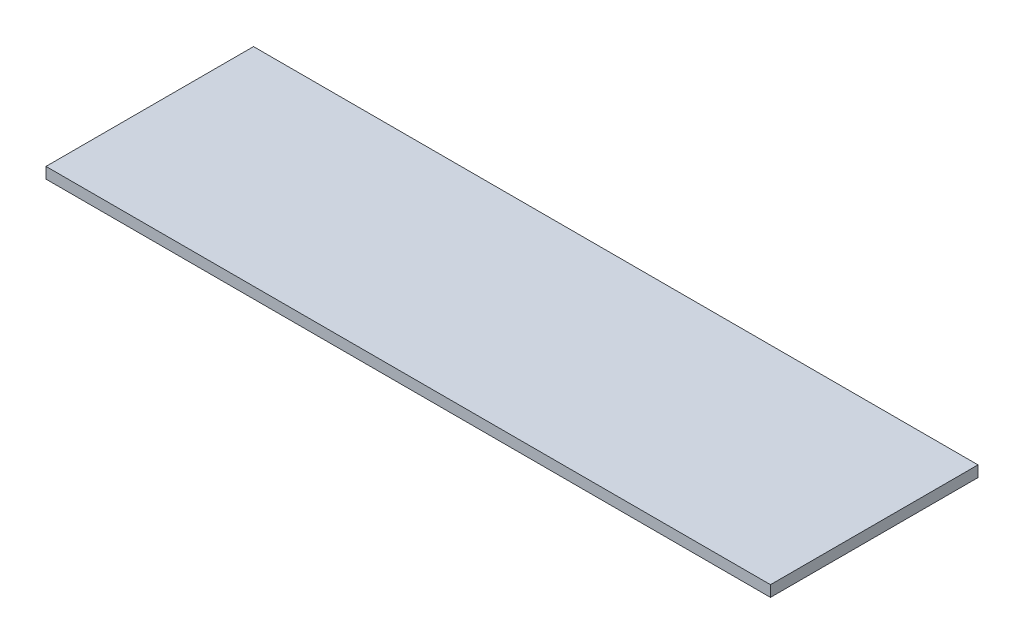
ISO-10303-21;
HEADER;
FILE_DESCRIPTION(('STEP AP214'),'2;1');
FILE_NAME('part.step','',(''),(''),'','','');
FILE_SCHEMA(('AUTOMOTIVE_DESIGN { 1 0 10303 214 1 1 1 1 }'));
ENDSEC;
DATA;
#1=APPLICATION_CONTEXT('core data for automotive mechanical design processes');
#2=APPLICATION_PROTOCOL_DEFINITION('international standard','automotive_design',2000,#1);
#3=PRODUCT_CONTEXT('',#1,'mechanical');
#4=PRODUCT('Part','Part','',(#3));
#5=PRODUCT_RELATED_PRODUCT_CATEGORY('part','',(#4));
#6=PRODUCT_DEFINITION_FORMATION('','',#4);
#7=PRODUCT_DEFINITION_CONTEXT('part definition',#1,'design');
#8=PRODUCT_DEFINITION('design','',#6,#7);
#9=PRODUCT_DEFINITION_SHAPE('','',#8);
#10=(LENGTH_UNIT() NAMED_UNIT(*) SI_UNIT(.MILLI.,.METRE.));
#11=(NAMED_UNIT(*) PLANE_ANGLE_UNIT() SI_UNIT($,.RADIAN.));
#12=(NAMED_UNIT(*) SI_UNIT($,.STERADIAN.) SOLID_ANGLE_UNIT());
#13=UNCERTAINTY_MEASURE_WITH_UNIT(LENGTH_MEASURE(1.E-05),#10,'distance_accuracy_value','');
#14=(GEOMETRIC_REPRESENTATION_CONTEXT(3) GLOBAL_UNCERTAINTY_ASSIGNED_CONTEXT((#13)) GLOBAL_UNIT_ASSIGNED_CONTEXT((#10,
#11,#12)) REPRESENTATION_CONTEXT('',''));
#15=CARTESIAN_POINT('',(0.,0.,0.));
#16=DIRECTION('',(0.,0.,1.));
#17=DIRECTION('',(1.,0.,0.));
#18=AXIS2_PLACEMENT_3D('',#15,#16,#17);
#19=CARTESIAN_POINT('',(-147.5,4.5,42.25));
#20=DIRECTION('',(1.,0.,0.));
#21=DIRECTION('',(0.,0.,-1.));
#22=AXIS2_PLACEMENT_3D('',#19,#20,#21);
#23=PLANE('',#22);
#24=DIRECTION('',(0.,0.,1.));
#25=VECTOR('',#24,1.);
#26=CARTESIAN_POINT('',(-147.5,0.,42.25));
#27=LINE('',#26,#25);
#28=CARTESIAN_POINT('',(-147.5,0.,-42.25));
#29=VERTEX_POINT('',#28);
#30=CARTESIAN_POINT('',(-147.5,0.,42.25));
#31=VERTEX_POINT('',#30);
#32=EDGE_CURVE('E96',#29,#31,#27,.T.);
#33=ORIENTED_EDGE('',*,*,#32,.T.);
#34=DIRECTION('',(0.,-1.,0.));
#35=VECTOR('',#34,1.);
#36=CARTESIAN_POINT('',(-147.5,4.5,42.25));
#37=LINE('',#36,#35);
#38=CARTESIAN_POINT('',(-147.5,4.5,42.25));
#39=VERTEX_POINT('',#38);
#40=EDGE_CURVE('E11',#39,#31,#37,.T.);
#41=ORIENTED_EDGE('',*,*,#40,.F.);
#42=DIRECTION('',(0.,0.,1.));
#43=VECTOR('',#42,1.);
#44=CARTESIAN_POINT('',(-147.5,4.5,42.25));
#45=LINE('',#44,#43);
#46=CARTESIAN_POINT('',(-147.5,4.5,-42.25));
#47=VERTEX_POINT('',#46);
#48=EDGE_CURVE('E84',#47,#39,#45,.T.);
#49=ORIENTED_EDGE('',*,*,#48,.F.);
#50=DIRECTION('',(0.,-1.,0.));
#51=VECTOR('',#50,1.);
#52=CARTESIAN_POINT('',(-147.5,4.5,-42.25));
#53=LINE('',#52,#51);
#54=EDGE_CURVE('E92',#47,#29,#53,.T.);
#55=ORIENTED_EDGE('',*,*,#54,.T.);
#56=EDGE_LOOP('',(#33,#41,#49,#55));
#57=FACE_BOUND('',#56,.T.);
#58=ADVANCED_FACE('F33',(#57),#23,.F.);
#59=CARTESIAN_POINT('',(147.5,4.5,42.25));
#60=DIRECTION('',(0.,0.,-1.));
#61=DIRECTION('',(-1.,0.,0.));
#62=AXIS2_PLACEMENT_3D('',#59,#60,#61);
#63=PLANE('',#62);
#64=DIRECTION('',(1.,0.,0.));
#65=VECTOR('',#64,1.);
#66=CARTESIAN_POINT('',(147.5,0.,42.25));
#67=LINE('',#66,#65);
#68=CARTESIAN_POINT('',(147.5,0.,42.25));
#69=VERTEX_POINT('',#68);
#70=EDGE_CURVE('E88',#31,#69,#67,.T.);
#71=ORIENTED_EDGE('',*,*,#70,.T.);
#72=DIRECTION('',(0.,-1.,0.));
#73=VECTOR('',#72,1.);
#74=CARTESIAN_POINT('',(147.5,4.5,42.25));
#75=LINE('',#74,#73);
#76=CARTESIAN_POINT('',(147.5,4.5,42.25));
#77=VERTEX_POINT('',#76);
#78=EDGE_CURVE('E41',#77,#69,#75,.T.);
#79=ORIENTED_EDGE('',*,*,#78,.F.);
#80=DIRECTION('',(1.,0.,0.));
#81=VECTOR('',#80,1.);
#82=CARTESIAN_POINT('',(147.5,4.5,42.25));
#83=LINE('',#82,#81);
#84=EDGE_CURVE('E79',#39,#77,#83,.T.);
#85=ORIENTED_EDGE('',*,*,#84,.F.);
#86=ORIENTED_EDGE('',*,*,#40,.T.);
#87=EDGE_LOOP('',(#71,#79,#85,#86));
#88=FACE_BOUND('',#87,.T.);
#89=ADVANCED_FACE('F87',(#88),#63,.F.);
#90=CARTESIAN_POINT('',(147.5,4.5,42.25));
#91=DIRECTION('',(-1.,0.,0.));
#92=DIRECTION('',(0.,0.,1.));
#93=AXIS2_PLACEMENT_3D('',#90,#91,#92);
#94=PLANE('',#93);
#95=DIRECTION('',(0.,0.,-1.));
#96=VECTOR('',#95,1.);
#97=CARTESIAN_POINT('',(147.5,0.,42.25));
#98=LINE('',#97,#96);
#99=CARTESIAN_POINT('',(147.5,0.,-42.25));
#100=VERTEX_POINT('',#99);
#101=EDGE_CURVE('E66',#69,#100,#98,.T.);
#102=ORIENTED_EDGE('',*,*,#101,.T.);
#103=DIRECTION('',(0.,-1.,0.));
#104=VECTOR('',#103,1.);
#105=CARTESIAN_POINT('',(147.5,4.5,-42.25));
#106=LINE('',#105,#104);
#107=CARTESIAN_POINT('',(147.5,4.5,-42.25));
#108=VERTEX_POINT('',#107);
#109=EDGE_CURVE('E89',#108,#100,#106,.T.);
#110=ORIENTED_EDGE('',*,*,#109,.F.);
#111=DIRECTION('',(0.,0.,-1.));
#112=VECTOR('',#111,1.);
#113=CARTESIAN_POINT('',(147.5,4.5,42.25));
#114=LINE('',#113,#112);
#115=EDGE_CURVE('E82',#77,#108,#114,.T.);
#116=ORIENTED_EDGE('',*,*,#115,.F.);
#117=ORIENTED_EDGE('',*,*,#78,.T.);
#118=EDGE_LOOP('',(#102,#110,#116,#117));
#119=FACE_BOUND('',#118,.T.);
#120=ADVANCED_FACE('F90',(#119),#94,.F.);
#121=CARTESIAN_POINT('',(147.5,4.5,-42.25));
#122=DIRECTION('',(0.,0.,1.));
#123=DIRECTION('',(1.,0.,0.));
#124=AXIS2_PLACEMENT_3D('',#121,#122,#123);
#125=PLANE('',#124);
#126=DIRECTION('',(-1.,0.,0.));
#127=VECTOR('',#126,1.);
#128=CARTESIAN_POINT('',(147.5,0.,-42.25));
#129=LINE('',#128,#127);
#130=EDGE_CURVE('E72',#100,#29,#129,.T.);
#131=ORIENTED_EDGE('',*,*,#130,.T.);
#132=ORIENTED_EDGE('',*,*,#54,.F.);
#133=DIRECTION('',(-1.,0.,0.));
#134=VECTOR('',#133,1.);
#135=CARTESIAN_POINT('',(147.5,4.5,-42.25));
#136=LINE('',#135,#134);
#137=EDGE_CURVE('E49',#108,#47,#136,.T.);
#138=ORIENTED_EDGE('',*,*,#137,.F.);
#139=ORIENTED_EDGE('',*,*,#109,.T.);
#140=EDGE_LOOP('',(#131,#132,#138,#139));
#141=FACE_BOUND('',#140,.T.);
#142=ADVANCED_FACE('F103',(#141),#125,.F.);
#143=CARTESIAN_POINT('',(0.,4.5,0.));
#144=DIRECTION('',(0.,1.,0.));
#145=DIRECTION('',(0.,0.,1.));
#146=AXIS2_PLACEMENT_3D('',#143,#144,#145);
#147=PLANE('',#146);
#148=ORIENTED_EDGE('',*,*,#48,.T.);
#149=ORIENTED_EDGE('',*,*,#84,.T.);
#150=ORIENTED_EDGE('',*,*,#115,.T.);
#151=ORIENTED_EDGE('',*,*,#137,.T.);
#152=EDGE_LOOP('',(#148,#149,#150,#151));
#153=FACE_BOUND('',#152,.T.);
#154=ADVANCED_FACE('F80',(#153),#147,.T.);
#155=CARTESIAN_POINT('',(0.,0.,0.));
#156=DIRECTION('',(0.,1.,0.));
#157=DIRECTION('',(0.,0.,1.));
#158=AXIS2_PLACEMENT_3D('',#155,#156,#157);
#159=PLANE('',#158);
#160=ORIENTED_EDGE('',*,*,#32,.F.);
#161=ORIENTED_EDGE('',*,*,#130,.F.);
#162=ORIENTED_EDGE('',*,*,#101,.F.);
#163=ORIENTED_EDGE('',*,*,#70,.F.);
#164=EDGE_LOOP('',(#160,#161,#162,#163));
#165=FACE_BOUND('',#164,.T.);
#166=ADVANCED_FACE('F106',(#165),#159,.F.);
#167=CLOSED_SHELL('',(#58,#89,#120,#142,#154,#166));
#168=MANIFOLD_SOLID_BREP('B2',#167);
#169=ADVANCED_BREP_SHAPE_REPRESENTATION('',(#18,#168),#14);
#170=SHAPE_DEFINITION_REPRESENTATION(#9,#169);
ENDSEC;
END-ISO-10303-21;
